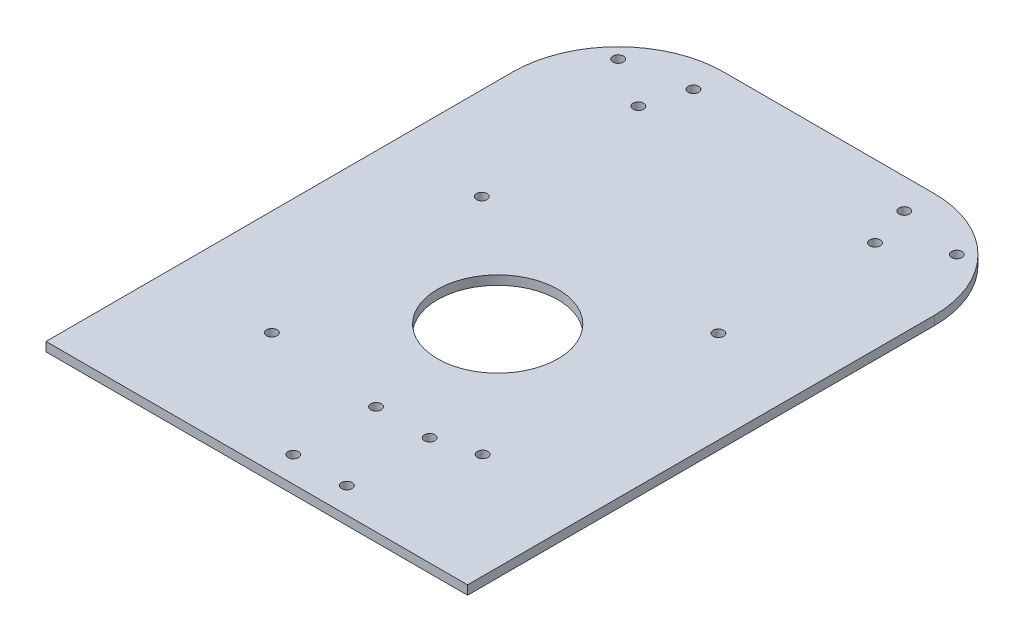
ISO-10303-21;
HEADER;
FILE_DESCRIPTION(('STEP AP214'),'2;1');
FILE_NAME('part.step','',(''),(''),'','','');
FILE_SCHEMA(('AUTOMOTIVE_DESIGN { 1 0 10303 214 1 1 1 1 }'));
ENDSEC;
DATA;
#1=APPLICATION_CONTEXT('core data for automotive mechanical design processes');
#2=APPLICATION_PROTOCOL_DEFINITION('international standard','automotive_design',2000,#1);
#3=PRODUCT_CONTEXT('',#1,'mechanical');
#4=PRODUCT('Part','Part','',(#3));
#5=PRODUCT_RELATED_PRODUCT_CATEGORY('part','',(#4));
#6=PRODUCT_DEFINITION_FORMATION('','',#4);
#7=PRODUCT_DEFINITION_CONTEXT('part definition',#1,'design');
#8=PRODUCT_DEFINITION('design','',#6,#7);
#9=PRODUCT_DEFINITION_SHAPE('','',#8);
#10=(LENGTH_UNIT() NAMED_UNIT(*) SI_UNIT(.MILLI.,.METRE.));
#11=(NAMED_UNIT(*) PLANE_ANGLE_UNIT() SI_UNIT($,.RADIAN.));
#12=(NAMED_UNIT(*) SI_UNIT($,.STERADIAN.) SOLID_ANGLE_UNIT());
#13=UNCERTAINTY_MEASURE_WITH_UNIT(LENGTH_MEASURE(1.E-05),#10,'distance_accuracy_value','');
#14=(GEOMETRIC_REPRESENTATION_CONTEXT(3) GLOBAL_UNCERTAINTY_ASSIGNED_CONTEXT((#13)) GLOBAL_UNIT_ASSIGNED_CONTEXT((#10,
#11,#12)) REPRESENTATION_CONTEXT('',''));
#15=CARTESIAN_POINT('',(0.,0.,0.));
#16=DIRECTION('',(0.,0.,1.));
#17=DIRECTION('',(1.,0.,0.));
#18=AXIS2_PLACEMENT_3D('',#15,#16,#17);
#19=CARTESIAN_POINT('',(70.,3.,-110.));
#20=DIRECTION('',(-1.,0.,0.));
#21=DIRECTION('',(0.,0.,1.));
#22=AXIS2_PLACEMENT_3D('',#19,#20,#21);
#23=PLANE('',#22);
#24=DIRECTION('',(0.,1.,0.));
#25=VECTOR('',#24,1.);
#26=CARTESIAN_POINT('',(70.,0.,-44.9999999999997));
#27=LINE('',#26,#25);
#28=CARTESIAN_POINT('',(70.,0.,-44.9999999999997));
#29=VERTEX_POINT('',#28);
#30=CARTESIAN_POINT('',(70.,3.,-44.9999999999997));
#31=VERTEX_POINT('',#30);
#32=EDGE_CURVE('E145',#29,#31,#27,.T.);
#33=ORIENTED_EDGE('',*,*,#32,.T.);
#34=DIRECTION('',(0.,0.,-1.));
#35=VECTOR('',#34,1.);
#36=CARTESIAN_POINT('',(70.,3.,-110.));
#37=LINE('',#36,#35);
#38=CARTESIAN_POINT('',(70.,3.,110.));
#39=VERTEX_POINT('',#38);
#40=EDGE_CURVE('E78',#39,#31,#37,.T.);
#41=ORIENTED_EDGE('',*,*,#40,.F.);
#42=DIRECTION('',(0.,-1.,0.));
#43=VECTOR('',#42,1.);
#44=CARTESIAN_POINT('',(70.,3.,110.));
#45=LINE('',#44,#43);
#46=CARTESIAN_POINT('',(70.,0.,110.));
#47=VERTEX_POINT('',#46);
#48=EDGE_CURVE('E42',#39,#47,#45,.T.);
#49=ORIENTED_EDGE('',*,*,#48,.T.);
#50=DIRECTION('',(0.,0.,-1.));
#51=VECTOR('',#50,1.);
#52=CARTESIAN_POINT('',(70.,0.,-110.));
#53=LINE('',#52,#51);
#54=EDGE_CURVE('E84',#47,#29,#53,.T.);
#55=ORIENTED_EDGE('',*,*,#54,.T.);
#56=EDGE_LOOP('',(#33,#41,#49,#55));
#57=FACE_BOUND('',#56,.T.);
#58=ADVANCED_FACE('F35',(#57),#23,.F.);
#59=CARTESIAN_POINT('',(0.,3.,0.));
#60=DIRECTION('',(0.,1.,0.));
#61=DIRECTION('',(0.,0.,1.));
#62=AXIS2_PLACEMENT_3D('',#59,#60,#61);
#63=PLANE('',#62);
#64=CARTESIAN_POINT('',(56.2132034355965,3.,-66.2132034355963));
#65=DIRECTION('',(0.,1.,0.));
#66=DIRECTION('',(0.,0.,-1.));
#67=AXIS2_PLACEMENT_3D('',#64,#65,#66);
#68=CIRCLE('',#67,1.75);
#69=CARTESIAN_POINT('',(56.2132034355965,3.,-67.9632034355963));
#70=VERTEX_POINT('',#69);
#71=EDGE_CURVE('E176',#70,#70,#68,.T.);
#72=ORIENTED_EDGE('',*,*,#71,.F.);
#73=EDGE_LOOP('',(#72));
#74=FACE_BOUND('',#73,.T.);
#75=CARTESIAN_POINT('',(-56.2132034355965,3.,-66.2132034355963));
#76=DIRECTION('',(0.,1.,0.));
#77=DIRECTION('',(0.,0.,1.));
#78=AXIS2_PLACEMENT_3D('',#75,#76,#77);
#79=CIRCLE('',#78,1.75000000000001);
#80=CARTESIAN_POINT('',(-56.2132034355965,3.,-64.4632034355963));
#81=VERTEX_POINT('',#80);
#82=EDGE_CURVE('E182',#81,#81,#79,.T.);
#83=ORIENTED_EDGE('',*,*,#82,.F.);
#84=EDGE_LOOP('',(#83));
#85=FACE_BOUND('',#84,.T.);
#86=CARTESIAN_POINT('',(39.3,3.,-56.));
#87=DIRECTION('',(0.,1.,0.));
#88=DIRECTION('',(0.,0.,1.));
#89=AXIS2_PLACEMENT_3D('',#86,#87,#88);
#90=CIRCLE('',#89,1.75);
#91=CARTESIAN_POINT('',(39.3,3.,-54.25));
#92=VERTEX_POINT('',#91);
#93=EDGE_CURVE('E188',#92,#92,#90,.T.);
#94=ORIENTED_EDGE('',*,*,#93,.F.);
#95=EDGE_LOOP('',(#94));
#96=FACE_BOUND('',#95,.T.);
#97=CARTESIAN_POINT('',(39.3,3.,-4.00000000000002));
#98=DIRECTION('',(0.,1.,0.));
#99=DIRECTION('',(0.,0.,1.));
#100=AXIS2_PLACEMENT_3D('',#97,#98,#99);
#101=CIRCLE('',#100,1.75);
#102=CARTESIAN_POINT('',(39.3,3.,-2.25000000000002));
#103=VERTEX_POINT('',#102);
#104=EDGE_CURVE('E194',#103,#103,#101,.T.);
#105=ORIENTED_EDGE('',*,*,#104,.F.);
#106=EDGE_LOOP('',(#105));
#107=FACE_BOUND('',#106,.T.);
#108=CARTESIAN_POINT('',(-39.3,3.,-56.));
#109=DIRECTION('',(0.,1.,0.));
#110=DIRECTION('',(0.,0.,1.));
#111=AXIS2_PLACEMENT_3D('',#108,#109,#110);
#112=CIRCLE('',#111,1.75);
#113=CARTESIAN_POINT('',(-39.3,3.,-54.25));
#114=VERTEX_POINT('',#113);
#115=EDGE_CURVE('E200',#114,#114,#112,.T.);
#116=ORIENTED_EDGE('',*,*,#115,.F.);
#117=EDGE_LOOP('',(#116));
#118=FACE_BOUND('',#117,.T.);
#119=CARTESIAN_POINT('',(-39.3,3.,-4.00000000000002));
#120=DIRECTION('',(0.,1.,0.));
#121=DIRECTION('',(0.,0.,1.));
#122=AXIS2_PLACEMENT_3D('',#119,#120,#121);
#123=CIRCLE('',#122,1.75);
#124=CARTESIAN_POINT('',(-39.3,3.,-2.25000000000002));
#125=VERTEX_POINT('',#124);
#126=EDGE_CURVE('E206',#125,#125,#123,.T.);
#127=ORIENTED_EDGE('',*,*,#126,.F.);
#128=EDGE_LOOP('',(#127));
#129=FACE_BOUND('',#128,.T.);
#130=CARTESIAN_POINT('',(35.,3.,-45.));
#131=DIRECTION('',(0.,-1.,0.));
#132=DIRECTION('',(0.,0.,1.));
#133=AXIS2_PLACEMENT_3D('',#130,#131,#132);
#134=CIRCLE('',#133,35.);
#135=CARTESIAN_POINT('',(34.9999999999998,3.,-80.));
#136=VERTEX_POINT('',#135);
#137=EDGE_CURVE('E162',#136,#31,#134,.T.);
#138=ORIENTED_EDGE('',*,*,#137,.F.);
#139=DIRECTION('',(1.,0.,0.));
#140=VECTOR('',#139,1.);
#141=CARTESIAN_POINT('',(-35.,3.,-80.));
#142=LINE('',#141,#140);
#143=CARTESIAN_POINT('',(-35.,3.,-80.));
#144=VERTEX_POINT('',#143);
#145=EDGE_CURVE('E165',#144,#136,#142,.T.);
#146=ORIENTED_EDGE('',*,*,#145,.F.);
#147=CARTESIAN_POINT('',(-35.,3.,-45.));
#148=DIRECTION('',(0.,-1.,0.));
#149=DIRECTION('',(0.,0.,-1.));
#150=AXIS2_PLACEMENT_3D('',#147,#148,#149);
#151=CIRCLE('',#150,35.);
#152=CARTESIAN_POINT('',(-70.,3.,-45.));
#153=VERTEX_POINT('',#152);
#154=EDGE_CURVE('E168',#153,#144,#151,.T.);
#155=ORIENTED_EDGE('',*,*,#154,.F.);
#156=DIRECTION('',(0.,0.,1.));
#157=VECTOR('',#156,1.);
#158=CARTESIAN_POINT('',(-70.,3.,-110.));
#159=LINE('',#158,#157);
#160=CARTESIAN_POINT('',(-70.,3.,110.));
#161=VERTEX_POINT('',#160);
#162=EDGE_CURVE('E99',#153,#161,#159,.T.);
#163=ORIENTED_EDGE('',*,*,#162,.T.);
#164=DIRECTION('',(1.,0.,0.));
#165=VECTOR('',#164,1.);
#166=CARTESIAN_POINT('',(-70.,3.,110.));
#167=LINE('',#166,#165);
#168=EDGE_CURVE('E58',#161,#39,#167,.T.);
#169=ORIENTED_EDGE('',*,*,#168,.T.);
#170=ORIENTED_EDGE('',*,*,#40,.T.);
#171=EDGE_LOOP('',(#138,#146,#155,#163,#169,#170));
#172=FACE_BOUND('',#171,.T.);
#173=CARTESIAN_POINT('',(35.,3.,-70.));
#174=DIRECTION('',(0.,1.,0.));
#175=DIRECTION('',(0.,0.,1.));
#176=AXIS2_PLACEMENT_3D('',#173,#174,#175);
#177=CIRCLE('',#176,1.75);
#178=CARTESIAN_POINT('',(35.,3.,-68.25));
#179=VERTEX_POINT('',#178);
#180=EDGE_CURVE('E136',#179,#179,#177,.T.);
#181=ORIENTED_EDGE('',*,*,#180,.F.);
#182=EDGE_LOOP('',(#181));
#183=FACE_BOUND('',#182,.T.);
#184=CARTESIAN_POINT('',(-35.,3.,70.));
#185=DIRECTION('',(0.,1.,0.));
#186=DIRECTION('',(0.,0.,1.));
#187=AXIS2_PLACEMENT_3D('',#184,#185,#186);
#188=CIRCLE('',#187,1.75);
#189=CARTESIAN_POINT('',(-35.,3.,71.75));
#190=VERTEX_POINT('',#189);
#191=EDGE_CURVE('E129',#190,#190,#188,.T.);
#192=ORIENTED_EDGE('',*,*,#191,.F.);
#193=EDGE_LOOP('',(#192));
#194=FACE_BOUND('',#193,.T.);
#195=CARTESIAN_POINT('',(35.,3.,70.));
#196=DIRECTION('',(0.,1.,0.));
#197=DIRECTION('',(0.,0.,1.));
#198=AXIS2_PLACEMENT_3D('',#195,#196,#197);
#199=CIRCLE('',#198,1.75);
#200=CARTESIAN_POINT('',(35.,3.,71.75));
#201=VERTEX_POINT('',#200);
#202=EDGE_CURVE('E148',#201,#201,#199,.T.);
#203=ORIENTED_EDGE('',*,*,#202,.F.);
#204=EDGE_LOOP('',(#203));
#205=FACE_BOUND('',#204,.T.);
#206=CARTESIAN_POINT('',(0.,3.,30.));
#207=DIRECTION('',(0.,1.,0.));
#208=DIRECTION('',(0.,0.,1.));
#209=AXIS2_PLACEMENT_3D('',#206,#207,#208);
#210=CIRCLE('',#209,20.);
#211=CARTESIAN_POINT('',(0.,3.,50.));
#212=VERTEX_POINT('',#211);
#213=EDGE_CURVE('E141',#212,#212,#210,.T.);
#214=ORIENTED_EDGE('',*,*,#213,.F.);
#215=EDGE_LOOP('',(#214));
#216=FACE_BOUND('',#215,.T.);
#217=CARTESIAN_POINT('',(-35.,3.,-70.));
#218=DIRECTION('',(0.,1.,0.));
#219=DIRECTION('',(0.,0.,1.));
#220=AXIS2_PLACEMENT_3D('',#217,#218,#219);
#221=CIRCLE('',#220,1.75);
#222=CARTESIAN_POINT('',(-35.,3.,-68.25));
#223=VERTEX_POINT('',#222);
#224=EDGE_CURVE('E123',#223,#223,#221,.T.);
#225=ORIENTED_EDGE('',*,*,#224,.F.);
#226=EDGE_LOOP('',(#225));
#227=FACE_BOUND('',#226,.T.);
#228=CARTESIAN_POINT('',(3.59999999999957,3.,101.5));
#229=DIRECTION('',(0.,1.,0.));
#230=DIRECTION('',(0.,0.,1.));
#231=AXIS2_PLACEMENT_3D('',#228,#229,#230);
#232=CIRCLE('',#231,1.75);
#233=CARTESIAN_POINT('',(3.59999999999957,3.,103.25));
#234=VERTEX_POINT('',#233);
#235=EDGE_CURVE('E108',#234,#234,#232,.T.);
#236=ORIENTED_EDGE('',*,*,#235,.F.);
#237=EDGE_LOOP('',(#236));
#238=FACE_BOUND('',#237,.T.);
#239=CARTESIAN_POINT('',(21.3999999999996,3.,74.0000000000003));
#240=DIRECTION('',(0.,1.,0.));
#241=DIRECTION('',(0.,0.,1.));
#242=AXIS2_PLACEMENT_3D('',#239,#240,#241);
#243=CIRCLE('',#242,1.75);
#244=CARTESIAN_POINT('',(21.3999999999996,3.,75.7500000000003));
#245=VERTEX_POINT('',#244);
#246=EDGE_CURVE('E91',#245,#245,#243,.T.);
#247=ORIENTED_EDGE('',*,*,#246,.F.);
#248=EDGE_LOOP('',(#247));
#249=FACE_BOUND('',#248,.T.);
#250=CARTESIAN_POINT('',(21.3999999999996,3.,101.5));
#251=DIRECTION('',(0.,1.,0.));
#252=DIRECTION('',(0.,0.,1.));
#253=AXIS2_PLACEMENT_3D('',#250,#251,#252);
#254=CIRCLE('',#253,1.75);
#255=CARTESIAN_POINT('',(21.3999999999996,3.,103.25));
#256=VERTEX_POINT('',#255);
#257=EDGE_CURVE('E103',#256,#256,#254,.T.);
#258=ORIENTED_EDGE('',*,*,#257,.F.);
#259=EDGE_LOOP('',(#258));
#260=FACE_BOUND('',#259,.T.);
#261=CARTESIAN_POINT('',(3.59999999999957,3.,74.0000000000003));
#262=DIRECTION('',(0.,1.,0.));
#263=DIRECTION('',(0.,0.,1.));
#264=AXIS2_PLACEMENT_3D('',#261,#262,#263);
#265=CIRCLE('',#264,1.75);
#266=CARTESIAN_POINT('',(3.59999999999957,3.,75.7500000000003));
#267=VERTEX_POINT('',#266);
#268=EDGE_CURVE('E114',#267,#267,#265,.T.);
#269=ORIENTED_EDGE('',*,*,#268,.F.);
#270=EDGE_LOOP('',(#269));
#271=FACE_BOUND('',#270,.T.);
#272=ADVANCED_FACE('F222',(#74,#85,#96,#107,#118,#129,#172,#183,#194,#205,#216,#227,#238,#249,
#260,#271),#63,.T.);
#273=CARTESIAN_POINT('',(0.,0.,0.));
#274=DIRECTION('',(0.,1.,0.));
#275=DIRECTION('',(0.,0.,1.));
#276=AXIS2_PLACEMENT_3D('',#273,#274,#275);
#277=PLANE('',#276);
#278=CARTESIAN_POINT('',(56.2132034355965,0.,-66.2132034355963));
#279=DIRECTION('',(0.,1.,0.));
#280=DIRECTION('',(0.,0.,-1.));
#281=AXIS2_PLACEMENT_3D('',#278,#279,#280);
#282=CIRCLE('',#281,1.75);
#283=CARTESIAN_POINT('',(56.2132034355965,0.,-67.9632034355963));
#284=VERTEX_POINT('',#283);
#285=EDGE_CURVE('E179',#284,#284,#282,.T.);
#286=ORIENTED_EDGE('',*,*,#285,.T.);
#287=EDGE_LOOP('',(#286));
#288=FACE_BOUND('',#287,.T.);
#289=CARTESIAN_POINT('',(-56.2132034355965,0.,-66.2132034355963));
#290=DIRECTION('',(0.,1.,0.));
#291=DIRECTION('',(0.,0.,1.));
#292=AXIS2_PLACEMENT_3D('',#289,#290,#291);
#293=CIRCLE('',#292,1.75000000000001);
#294=CARTESIAN_POINT('',(-56.2132034355965,0.,-64.4632034355963));
#295=VERTEX_POINT('',#294);
#296=EDGE_CURVE('E185',#295,#295,#293,.T.);
#297=ORIENTED_EDGE('',*,*,#296,.T.);
#298=EDGE_LOOP('',(#297));
#299=FACE_BOUND('',#298,.T.);
#300=CARTESIAN_POINT('',(39.3,0.,-56.));
#301=DIRECTION('',(0.,1.,0.));
#302=DIRECTION('',(0.,0.,1.));
#303=AXIS2_PLACEMENT_3D('',#300,#301,#302);
#304=CIRCLE('',#303,1.75);
#305=CARTESIAN_POINT('',(39.3,0.,-54.25));
#306=VERTEX_POINT('',#305);
#307=EDGE_CURVE('E191',#306,#306,#304,.T.);
#308=ORIENTED_EDGE('',*,*,#307,.T.);
#309=EDGE_LOOP('',(#308));
#310=FACE_BOUND('',#309,.T.);
#311=CARTESIAN_POINT('',(39.3,0.,-4.00000000000002));
#312=DIRECTION('',(0.,1.,0.));
#313=DIRECTION('',(0.,0.,1.));
#314=AXIS2_PLACEMENT_3D('',#311,#312,#313);
#315=CIRCLE('',#314,1.75);
#316=CARTESIAN_POINT('',(39.3,0.,-2.25000000000002));
#317=VERTEX_POINT('',#316);
#318=EDGE_CURVE('E197',#317,#317,#315,.T.);
#319=ORIENTED_EDGE('',*,*,#318,.T.);
#320=EDGE_LOOP('',(#319));
#321=FACE_BOUND('',#320,.T.);
#322=CARTESIAN_POINT('',(-39.3,0.,-56.));
#323=DIRECTION('',(0.,1.,0.));
#324=DIRECTION('',(0.,0.,1.));
#325=AXIS2_PLACEMENT_3D('',#322,#323,#324);
#326=CIRCLE('',#325,1.75);
#327=CARTESIAN_POINT('',(-39.3,0.,-54.25));
#328=VERTEX_POINT('',#327);
#329=EDGE_CURVE('E203',#328,#328,#326,.T.);
#330=ORIENTED_EDGE('',*,*,#329,.T.);
#331=EDGE_LOOP('',(#330));
#332=FACE_BOUND('',#331,.T.);
#333=CARTESIAN_POINT('',(-39.3,0.,-4.00000000000002));
#334=DIRECTION('',(0.,1.,0.));
#335=DIRECTION('',(0.,0.,1.));
#336=AXIS2_PLACEMENT_3D('',#333,#334,#335);
#337=CIRCLE('',#336,1.75);
#338=CARTESIAN_POINT('',(-39.3,0.,-2.25000000000002));
#339=VERTEX_POINT('',#338);
#340=EDGE_CURVE('E171',#339,#339,#337,.T.);
#341=ORIENTED_EDGE('',*,*,#340,.T.);
#342=EDGE_LOOP('',(#341));
#343=FACE_BOUND('',#342,.T.);
#344=CARTESIAN_POINT('',(35.,0.,-70.));
#345=DIRECTION('',(0.,1.,0.));
#346=DIRECTION('',(0.,0.,1.));
#347=AXIS2_PLACEMENT_3D('',#344,#345,#346);
#348=CIRCLE('',#347,1.75);
#349=CARTESIAN_POINT('',(35.,0.,-68.25));
#350=VERTEX_POINT('',#349);
#351=EDGE_CURVE('E126',#350,#350,#348,.T.);
#352=ORIENTED_EDGE('',*,*,#351,.T.);
#353=EDGE_LOOP('',(#352));
#354=FACE_BOUND('',#353,.T.);
#355=CARTESIAN_POINT('',(-35.,0.,70.));
#356=DIRECTION('',(0.,1.,0.));
#357=DIRECTION('',(0.,0.,1.));
#358=AXIS2_PLACEMENT_3D('',#355,#356,#357);
#359=CIRCLE('',#358,1.75);
#360=CARTESIAN_POINT('',(-35.,0.,71.75));
#361=VERTEX_POINT('',#360);
#362=EDGE_CURVE('E132',#361,#361,#359,.T.);
#363=ORIENTED_EDGE('',*,*,#362,.T.);
#364=EDGE_LOOP('',(#363));
#365=FACE_BOUND('',#364,.T.);
#366=CARTESIAN_POINT('',(35.,0.,70.));
#367=DIRECTION('',(0.,1.,0.));
#368=DIRECTION('',(0.,0.,1.));
#369=AXIS2_PLACEMENT_3D('',#366,#367,#368);
#370=CIRCLE('',#369,1.75);
#371=CARTESIAN_POINT('',(35.,0.,71.75));
#372=VERTEX_POINT('',#371);
#373=EDGE_CURVE('E133',#372,#372,#370,.T.);
#374=ORIENTED_EDGE('',*,*,#373,.T.);
#375=EDGE_LOOP('',(#374));
#376=FACE_BOUND('',#375,.T.);
#377=CARTESIAN_POINT('',(0.,0.,30.));
#378=DIRECTION('',(0.,1.,0.));
#379=DIRECTION('',(0.,0.,1.));
#380=AXIS2_PLACEMENT_3D('',#377,#378,#379);
#381=CIRCLE('',#380,20.);
#382=CARTESIAN_POINT('',(0.,0.,50.));
#383=VERTEX_POINT('',#382);
#384=EDGE_CURVE('E144',#383,#383,#381,.T.);
#385=ORIENTED_EDGE('',*,*,#384,.T.);
#386=EDGE_LOOP('',(#385));
#387=FACE_BOUND('',#386,.T.);
#388=CARTESIAN_POINT('',(-35.,0.,-70.));
#389=DIRECTION('',(0.,1.,0.));
#390=DIRECTION('',(0.,0.,1.));
#391=AXIS2_PLACEMENT_3D('',#388,#389,#390);
#392=CIRCLE('',#391,1.75);
#393=CARTESIAN_POINT('',(-35.,0.,-68.25));
#394=VERTEX_POINT('',#393);
#395=EDGE_CURVE('E120',#394,#394,#392,.T.);
#396=ORIENTED_EDGE('',*,*,#395,.T.);
#397=EDGE_LOOP('',(#396));
#398=FACE_BOUND('',#397,.T.);
#399=DIRECTION('',(1.,0.,0.));
#400=VECTOR('',#399,1.);
#401=CARTESIAN_POINT('',(-35.,0.,-80.));
#402=LINE('',#401,#400);
#403=CARTESIAN_POINT('',(-35.,0.,-80.));
#404=VERTEX_POINT('',#403);
#405=CARTESIAN_POINT('',(34.9999999999998,0.,-80.));
#406=VERTEX_POINT('',#405);
#407=EDGE_CURVE('E173',#404,#406,#402,.T.);
#408=ORIENTED_EDGE('',*,*,#407,.T.);
#409=CARTESIAN_POINT('',(35.,0.,-45.));
#410=DIRECTION('',(0.,-1.,0.));
#411=DIRECTION('',(0.,0.,1.));
#412=AXIS2_PLACEMENT_3D('',#409,#410,#411);
#413=CIRCLE('',#412,35.);
#414=EDGE_CURVE('E90',#406,#29,#413,.T.);
#415=ORIENTED_EDGE('',*,*,#414,.T.);
#416=ORIENTED_EDGE('',*,*,#54,.F.);
#417=DIRECTION('',(1.,0.,0.));
#418=VECTOR('',#417,1.);
#419=CARTESIAN_POINT('',(-70.,0.,110.));
#420=LINE('',#419,#418);
#421=CARTESIAN_POINT('',(-70.,0.,110.));
#422=VERTEX_POINT('',#421);
#423=EDGE_CURVE('E70',#422,#47,#420,.T.);
#424=ORIENTED_EDGE('',*,*,#423,.F.);
#425=DIRECTION('',(0.,0.,1.));
#426=VECTOR('',#425,1.);
#427=CARTESIAN_POINT('',(-70.,0.,-110.));
#428=LINE('',#427,#426);
#429=CARTESIAN_POINT('',(-70.,0.,-44.9999999999997));
#430=VERTEX_POINT('',#429);
#431=EDGE_CURVE('E79',#430,#422,#428,.T.);
#432=ORIENTED_EDGE('',*,*,#431,.F.);
#433=CARTESIAN_POINT('',(-35.,0.,-45.));
#434=DIRECTION('',(0.,-1.,0.));
#435=DIRECTION('',(0.,0.,-1.));
#436=AXIS2_PLACEMENT_3D('',#433,#434,#435);
#437=CIRCLE('',#436,35.);
#438=EDGE_CURVE('E49',#430,#404,#437,.T.);
#439=ORIENTED_EDGE('',*,*,#438,.T.);
#440=EDGE_LOOP('',(#408,#415,#416,#424,#432,#439));
#441=FACE_BOUND('',#440,.T.);
#442=CARTESIAN_POINT('',(21.3999999999996,0.,74.0000000000003));
#443=DIRECTION('',(0.,1.,0.));
#444=DIRECTION('',(0.,0.,1.));
#445=AXIS2_PLACEMENT_3D('',#442,#443,#444);
#446=CIRCLE('',#445,1.75);
#447=CARTESIAN_POINT('',(21.3999999999996,0.,75.7500000000003));
#448=VERTEX_POINT('',#447);
#449=EDGE_CURVE('E95',#448,#448,#446,.T.);
#450=ORIENTED_EDGE('',*,*,#449,.T.);
#451=EDGE_LOOP('',(#450));
#452=FACE_BOUND('',#451,.T.);
#453=CARTESIAN_POINT('',(21.3999999999996,0.,101.5));
#454=DIRECTION('',(0.,1.,0.));
#455=DIRECTION('',(0.,0.,1.));
#456=AXIS2_PLACEMENT_3D('',#453,#454,#455);
#457=CIRCLE('',#456,1.75);
#458=CARTESIAN_POINT('',(21.3999999999996,0.,103.25));
#459=VERTEX_POINT('',#458);
#460=EDGE_CURVE('E105',#459,#459,#457,.T.);
#461=ORIENTED_EDGE('',*,*,#460,.T.);
#462=EDGE_LOOP('',(#461));
#463=FACE_BOUND('',#462,.T.);
#464=CARTESIAN_POINT('',(3.59999999999957,0.,101.5));
#465=DIRECTION('',(0.,1.,0.));
#466=DIRECTION('',(0.,0.,1.));
#467=AXIS2_PLACEMENT_3D('',#464,#465,#466);
#468=CIRCLE('',#467,1.75);
#469=CARTESIAN_POINT('',(3.59999999999957,0.,103.25));
#470=VERTEX_POINT('',#469);
#471=EDGE_CURVE('E111',#470,#470,#468,.T.);
#472=ORIENTED_EDGE('',*,*,#471,.T.);
#473=EDGE_LOOP('',(#472));
#474=FACE_BOUND('',#473,.T.);
#475=CARTESIAN_POINT('',(3.59999999999957,0.,74.0000000000003));
#476=DIRECTION('',(0.,1.,0.));
#477=DIRECTION('',(0.,0.,1.));
#478=AXIS2_PLACEMENT_3D('',#475,#476,#477);
#479=CIRCLE('',#478,1.75);
#480=CARTESIAN_POINT('',(3.59999999999957,0.,75.7500000000003));
#481=VERTEX_POINT('',#480);
#482=EDGE_CURVE('E117',#481,#481,#479,.T.);
#483=ORIENTED_EDGE('',*,*,#482,.T.);
#484=EDGE_LOOP('',(#483));
#485=FACE_BOUND('',#484,.T.);
#486=ADVANCED_FACE('F87',(#288,#299,#310,#321,#332,#343,#354,#365,#376,#387,#398,#441,#452,#463,
#474,#485),#277,.F.);
#487=CARTESIAN_POINT('',(-70.,3.,-110.));
#488=DIRECTION('',(1.,0.,0.));
#489=DIRECTION('',(0.,0.,-1.));
#490=AXIS2_PLACEMENT_3D('',#487,#488,#489);
#491=PLANE('',#490);
#492=ORIENTED_EDGE('',*,*,#162,.F.);
#493=DIRECTION('',(0.,1.,0.));
#494=VECTOR('',#493,1.);
#495=CARTESIAN_POINT('',(-70.,0.,-45.));
#496=LINE('',#495,#494);
#497=EDGE_CURVE('E153',#430,#153,#496,.T.);
#498=ORIENTED_EDGE('',*,*,#497,.F.);
#499=ORIENTED_EDGE('',*,*,#431,.T.);
#500=DIRECTION('',(0.,-1.,0.));
#501=VECTOR('',#500,1.);
#502=CARTESIAN_POINT('',(-70.,3.,110.));
#503=LINE('',#502,#501);
#504=EDGE_CURVE('E11',#161,#422,#503,.T.);
#505=ORIENTED_EDGE('',*,*,#504,.F.);
#506=EDGE_LOOP('',(#492,#498,#499,#505));
#507=FACE_BOUND('',#506,.T.);
#508=ADVANCED_FACE('F257',(#507),#491,.F.);
#509=CARTESIAN_POINT('',(-70.,3.,110.));
#510=DIRECTION('',(0.,0.,-1.));
#511=DIRECTION('',(-1.,0.,0.));
#512=AXIS2_PLACEMENT_3D('',#509,#510,#511);
#513=PLANE('',#512);
#514=ORIENTED_EDGE('',*,*,#423,.T.);
#515=ORIENTED_EDGE('',*,*,#48,.F.);
#516=ORIENTED_EDGE('',*,*,#168,.F.);
#517=ORIENTED_EDGE('',*,*,#504,.T.);
#518=EDGE_LOOP('',(#514,#515,#516,#517));
#519=FACE_BOUND('',#518,.T.);
#520=ADVANCED_FACE('F72',(#519),#513,.F.);
#521=CARTESIAN_POINT('',(21.3999999999996,3.,74.0000000000003));
#522=DIRECTION('',(0.,-1.,0.));
#523=DIRECTION('',(0.,0.,-1.));
#524=AXIS2_PLACEMENT_3D('',#521,#522,#523);
#525=CYLINDRICAL_SURFACE('',#524,1.75);
#526=ORIENTED_EDGE('',*,*,#246,.T.);
#527=EDGE_LOOP('',(#526));
#528=FACE_BOUND('',#527,.T.);
#529=ORIENTED_EDGE('',*,*,#449,.F.);
#530=EDGE_LOOP('',(#529));
#531=FACE_BOUND('',#530,.T.);
#532=ADVANCED_FACE('F401',(#528,#531),#525,.F.);
#533=CARTESIAN_POINT('',(21.3999999999996,3.,101.5));
#534=DIRECTION('',(0.,-1.,0.));
#535=DIRECTION('',(0.,0.,-1.));
#536=AXIS2_PLACEMENT_3D('',#533,#534,#535);
#537=CYLINDRICAL_SURFACE('',#536,1.75);
#538=ORIENTED_EDGE('',*,*,#257,.T.);
#539=EDGE_LOOP('',(#538));
#540=FACE_BOUND('',#539,.T.);
#541=ORIENTED_EDGE('',*,*,#460,.F.);
#542=EDGE_LOOP('',(#541));
#543=FACE_BOUND('',#542,.T.);
#544=ADVANCED_FACE('F397',(#540,#543),#537,.F.);
#545=CARTESIAN_POINT('',(3.59999999999957,3.,101.5));
#546=DIRECTION('',(0.,-1.,0.));
#547=DIRECTION('',(0.,0.,-1.));
#548=AXIS2_PLACEMENT_3D('',#545,#546,#547);
#549=CYLINDRICAL_SURFACE('',#548,1.75);
#550=ORIENTED_EDGE('',*,*,#235,.T.);
#551=EDGE_LOOP('',(#550));
#552=FACE_BOUND('',#551,.T.);
#553=ORIENTED_EDGE('',*,*,#471,.F.);
#554=EDGE_LOOP('',(#553));
#555=FACE_BOUND('',#554,.T.);
#556=ADVANCED_FACE('F252',(#552,#555),#549,.F.);
#557=CARTESIAN_POINT('',(3.59999999999957,3.,74.0000000000003));
#558=DIRECTION('',(0.,-1.,0.));
#559=DIRECTION('',(0.,0.,-1.));
#560=AXIS2_PLACEMENT_3D('',#557,#558,#559);
#561=CYLINDRICAL_SURFACE('',#560,1.75);
#562=ORIENTED_EDGE('',*,*,#268,.T.);
#563=EDGE_LOOP('',(#562));
#564=FACE_BOUND('',#563,.T.);
#565=ORIENTED_EDGE('',*,*,#482,.F.);
#566=EDGE_LOOP('',(#565));
#567=FACE_BOUND('',#566,.T.);
#568=ADVANCED_FACE('F248',(#564,#567),#561,.F.);
#569=CARTESIAN_POINT('',(-35.,0.,-70.));
#570=DIRECTION('',(0.,1.,0.));
#571=DIRECTION('',(0.,0.,1.));
#572=AXIS2_PLACEMENT_3D('',#569,#570,#571);
#573=CYLINDRICAL_SURFACE('',#572,1.75);
#574=ORIENTED_EDGE('',*,*,#395,.F.);
#575=EDGE_LOOP('',(#574));
#576=FACE_BOUND('',#575,.T.);
#577=ORIENTED_EDGE('',*,*,#224,.T.);
#578=EDGE_LOOP('',(#577));
#579=FACE_BOUND('',#578,.T.);
#580=ADVANCED_FACE('F251',(#576,#579),#573,.F.);
#581=CARTESIAN_POINT('',(0.,0.,30.));
#582=DIRECTION('',(0.,1.,0.));
#583=DIRECTION('',(0.,0.,1.));
#584=AXIS2_PLACEMENT_3D('',#581,#582,#583);
#585=CYLINDRICAL_SURFACE('',#584,20.);
#586=ORIENTED_EDGE('',*,*,#384,.F.);
#587=EDGE_LOOP('',(#586));
#588=FACE_BOUND('',#587,.T.);
#589=ORIENTED_EDGE('',*,*,#213,.T.);
#590=EDGE_LOOP('',(#589));
#591=FACE_BOUND('',#590,.T.);
#592=ADVANCED_FACE('F382',(#588,#591),#585,.F.);
#593=CARTESIAN_POINT('',(35.,0.,70.));
#594=DIRECTION('',(0.,1.,0.));
#595=DIRECTION('',(0.,0.,1.));
#596=AXIS2_PLACEMENT_3D('',#593,#594,#595);
#597=CYLINDRICAL_SURFACE('',#596,1.75);
#598=ORIENTED_EDGE('',*,*,#373,.F.);
#599=EDGE_LOOP('',(#598));
#600=FACE_BOUND('',#599,.T.);
#601=ORIENTED_EDGE('',*,*,#202,.T.);
#602=EDGE_LOOP('',(#601));
#603=FACE_BOUND('',#602,.T.);
#604=ADVANCED_FACE('F378',(#600,#603),#597,.F.);
#605=CARTESIAN_POINT('',(-35.,0.,70.));
#606=DIRECTION('',(0.,1.,0.));
#607=DIRECTION('',(0.,0.,1.));
#608=AXIS2_PLACEMENT_3D('',#605,#606,#607);
#609=CYLINDRICAL_SURFACE('',#608,1.75);
#610=ORIENTED_EDGE('',*,*,#362,.F.);
#611=EDGE_LOOP('',(#610));
#612=FACE_BOUND('',#611,.T.);
#613=ORIENTED_EDGE('',*,*,#191,.T.);
#614=EDGE_LOOP('',(#613));
#615=FACE_BOUND('',#614,.T.);
#616=ADVANCED_FACE('F381',(#612,#615),#609,.F.);
#617=CARTESIAN_POINT('',(35.,0.,-70.));
#618=DIRECTION('',(0.,1.,0.));
#619=DIRECTION('',(0.,0.,1.));
#620=AXIS2_PLACEMENT_3D('',#617,#618,#619);
#621=CYLINDRICAL_SURFACE('',#620,1.75);
#622=ORIENTED_EDGE('',*,*,#351,.F.);
#623=EDGE_LOOP('',(#622));
#624=FACE_BOUND('',#623,.T.);
#625=ORIENTED_EDGE('',*,*,#180,.T.);
#626=EDGE_LOOP('',(#625));
#627=FACE_BOUND('',#626,.T.);
#628=ADVANCED_FACE('F297',(#624,#627),#621,.F.);
#629=CARTESIAN_POINT('',(35.,0.,-45.));
#630=DIRECTION('',(0.,1.,0.));
#631=DIRECTION('',(0.,0.,1.));
#632=AXIS2_PLACEMENT_3D('',#629,#630,#631);
#633=CYLINDRICAL_SURFACE('',#632,35.);
#634=ORIENTED_EDGE('',*,*,#137,.T.);
#635=ORIENTED_EDGE('',*,*,#32,.F.);
#636=ORIENTED_EDGE('',*,*,#414,.F.);
#637=DIRECTION('',(0.,1.,0.));
#638=VECTOR('',#637,1.);
#639=CARTESIAN_POINT('',(34.9999999999998,0.,-80.));
#640=LINE('',#639,#638);
#641=EDGE_CURVE('E158',#406,#136,#640,.T.);
#642=ORIENTED_EDGE('',*,*,#641,.T.);
#643=EDGE_LOOP('',(#634,#635,#636,#642));
#644=FACE_BOUND('',#643,.T.);
#645=ADVANCED_FACE('F291',(#644),#633,.T.);
#646=CARTESIAN_POINT('',(-35.,0.,-80.));
#647=DIRECTION('',(0.,0.,1.));
#648=DIRECTION('',(1.,0.,0.));
#649=AXIS2_PLACEMENT_3D('',#646,#647,#648);
#650=PLANE('',#649);
#651=ORIENTED_EDGE('',*,*,#145,.T.);
#652=ORIENTED_EDGE('',*,*,#641,.F.);
#653=ORIENTED_EDGE('',*,*,#407,.F.);
#654=DIRECTION('',(0.,1.,0.));
#655=VECTOR('',#654,1.);
#656=CARTESIAN_POINT('',(-35.,0.,-80.));
#657=LINE('',#656,#655);
#658=EDGE_CURVE('E155',#404,#144,#657,.T.);
#659=ORIENTED_EDGE('',*,*,#658,.T.);
#660=EDGE_LOOP('',(#651,#652,#653,#659));
#661=FACE_BOUND('',#660,.T.);
#662=ADVANCED_FACE('F296',(#661),#650,.F.);
#663=CARTESIAN_POINT('',(-35.,0.,-45.));
#664=DIRECTION('',(0.,1.,0.));
#665=DIRECTION('',(0.,0.,1.));
#666=AXIS2_PLACEMENT_3D('',#663,#664,#665);
#667=CYLINDRICAL_SURFACE('',#666,35.);
#668=ORIENTED_EDGE('',*,*,#154,.T.);
#669=ORIENTED_EDGE('',*,*,#658,.F.);
#670=ORIENTED_EDGE('',*,*,#438,.F.);
#671=ORIENTED_EDGE('',*,*,#497,.T.);
#672=EDGE_LOOP('',(#668,#669,#670,#671));
#673=FACE_BOUND('',#672,.T.);
#674=ADVANCED_FACE('F218',(#673),#667,.T.);
#675=CARTESIAN_POINT('',(-39.3,0.,-4.00000000000002));
#676=DIRECTION('',(0.,1.,0.));
#677=DIRECTION('',(0.,0.,1.));
#678=AXIS2_PLACEMENT_3D('',#675,#676,#677);
#679=CYLINDRICAL_SURFACE('',#678,1.75);
#680=ORIENTED_EDGE('',*,*,#340,.F.);
#681=EDGE_LOOP('',(#680));
#682=FACE_BOUND('',#681,.T.);
#683=ORIENTED_EDGE('',*,*,#126,.T.);
#684=EDGE_LOOP('',(#683));
#685=FACE_BOUND('',#684,.T.);
#686=ADVANCED_FACE('F214',(#682,#685),#679,.F.);
#687=CARTESIAN_POINT('',(-39.3,0.,-56.));
#688=DIRECTION('',(0.,1.,0.));
#689=DIRECTION('',(0.,0.,1.));
#690=AXIS2_PLACEMENT_3D('',#687,#688,#689);
#691=CYLINDRICAL_SURFACE('',#690,1.75);
#692=ORIENTED_EDGE('',*,*,#329,.F.);
#693=EDGE_LOOP('',(#692));
#694=FACE_BOUND('',#693,.T.);
#695=ORIENTED_EDGE('',*,*,#115,.T.);
#696=EDGE_LOOP('',(#695));
#697=FACE_BOUND('',#696,.T.);
#698=ADVANCED_FACE('F217',(#694,#697),#691,.F.);
#699=CARTESIAN_POINT('',(39.3,0.,-4.00000000000002));
#700=DIRECTION('',(0.,1.,0.));
#701=DIRECTION('',(0.,0.,1.));
#702=AXIS2_PLACEMENT_3D('',#699,#700,#701);
#703=CYLINDRICAL_SURFACE('',#702,1.75);
#704=ORIENTED_EDGE('',*,*,#318,.F.);
#705=EDGE_LOOP('',(#704));
#706=FACE_BOUND('',#705,.T.);
#707=ORIENTED_EDGE('',*,*,#104,.T.);
#708=EDGE_LOOP('',(#707));
#709=FACE_BOUND('',#708,.T.);
#710=ADVANCED_FACE('F331',(#706,#709),#703,.F.);
#711=CARTESIAN_POINT('',(39.3,0.,-56.));
#712=DIRECTION('',(0.,1.,0.));
#713=DIRECTION('',(0.,0.,1.));
#714=AXIS2_PLACEMENT_3D('',#711,#712,#713);
#715=CYLINDRICAL_SURFACE('',#714,1.75);
#716=ORIENTED_EDGE('',*,*,#307,.F.);
#717=EDGE_LOOP('',(#716));
#718=FACE_BOUND('',#717,.T.);
#719=ORIENTED_EDGE('',*,*,#93,.T.);
#720=EDGE_LOOP('',(#719));
#721=FACE_BOUND('',#720,.T.);
#722=ADVANCED_FACE('F341',(#718,#721),#715,.F.);
#723=CARTESIAN_POINT('',(-56.2132034355965,0.,-66.2132034355963));
#724=DIRECTION('',(0.,1.,0.));
#725=DIRECTION('',(0.,0.,1.));
#726=AXIS2_PLACEMENT_3D('',#723,#724,#725);
#727=CYLINDRICAL_SURFACE('',#726,1.75000000000001);
#728=ORIENTED_EDGE('',*,*,#296,.F.);
#729=EDGE_LOOP('',(#728));
#730=FACE_BOUND('',#729,.T.);
#731=ORIENTED_EDGE('',*,*,#82,.T.);
#732=EDGE_LOOP('',(#731));
#733=FACE_BOUND('',#732,.T.);
#734=ADVANCED_FACE('F351',(#730,#733),#727,.F.);
#735=CARTESIAN_POINT('',(56.2132034355965,0.,-66.2132034355963));
#736=DIRECTION('',(0.,1.,0.));
#737=DIRECTION('',(0.,0.,1.));
#738=AXIS2_PLACEMENT_3D('',#735,#736,#737);
#739=CYLINDRICAL_SURFACE('',#738,1.75);
#740=ORIENTED_EDGE('',*,*,#285,.F.);
#741=EDGE_LOOP('',(#740));
#742=FACE_BOUND('',#741,.T.);
#743=ORIENTED_EDGE('',*,*,#71,.T.);
#744=EDGE_LOOP('',(#743));
#745=FACE_BOUND('',#744,.T.);
#746=ADVANCED_FACE('F361',(#742,#745),#739,.F.);
#747=CLOSED_SHELL('',(#58,#272,#486,#508,#520,#532,#544,#556,#568,#580,#592,#604,#616,#628,#645,
#662,#674,#686,#698,#710,#722,#734,#746));
#748=MANIFOLD_SOLID_BREP('B2',#747);
#749=ADVANCED_BREP_SHAPE_REPRESENTATION('',(#18,#748),#14);
#750=SHAPE_DEFINITION_REPRESENTATION(#9,#749);
ENDSEC;
END-ISO-10303-21;
